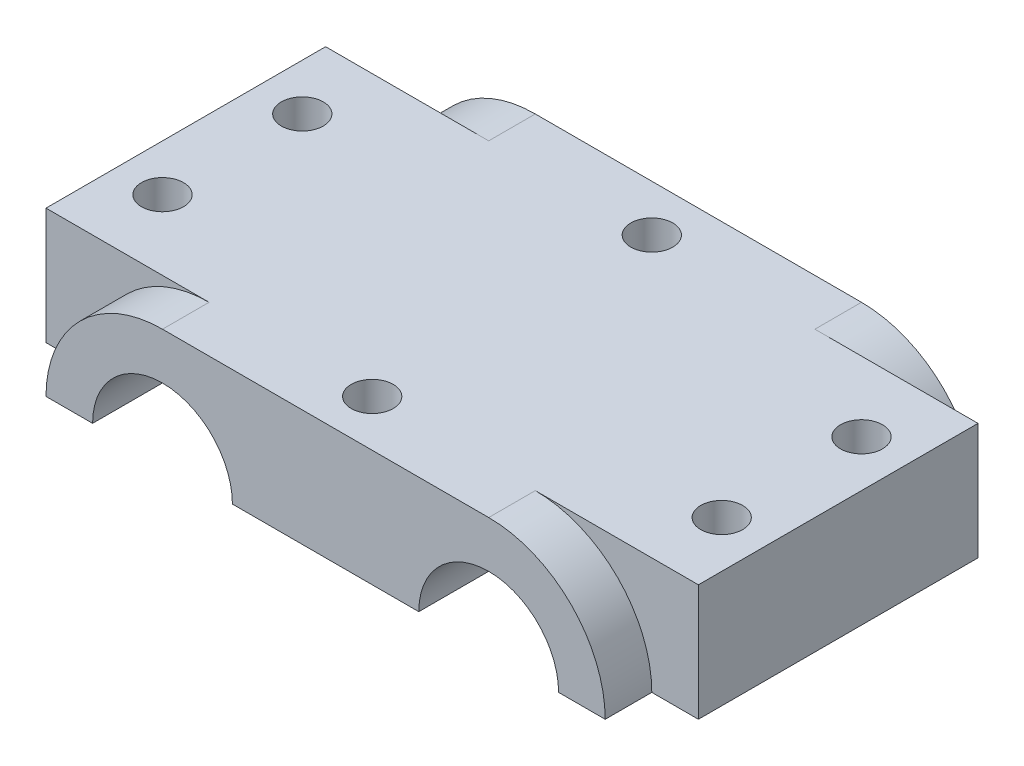
ISO-10303-21;
HEADER;
FILE_DESCRIPTION(('STEP AP214'),'2;1');
FILE_NAME('part.step','',(''),(''),'','','');
FILE_SCHEMA(('AUTOMOTIVE_DESIGN { 1 0 10303 214 1 1 1 1 }'));
ENDSEC;
DATA;
#1=APPLICATION_CONTEXT('core data for automotive mechanical design processes');
#2=APPLICATION_PROTOCOL_DEFINITION('international standard','automotive_design',2000,#1);
#3=PRODUCT_CONTEXT('',#1,'mechanical');
#4=PRODUCT('Part','Part','',(#3));
#5=PRODUCT_RELATED_PRODUCT_CATEGORY('part','',(#4));
#6=PRODUCT_DEFINITION_FORMATION('','',#4);
#7=PRODUCT_DEFINITION_CONTEXT('part definition',#1,'design');
#8=PRODUCT_DEFINITION('design','',#6,#7);
#9=PRODUCT_DEFINITION_SHAPE('','',#8);
#10=(LENGTH_UNIT() NAMED_UNIT(*) SI_UNIT(.MILLI.,.METRE.));
#11=(NAMED_UNIT(*) PLANE_ANGLE_UNIT() SI_UNIT($,.RADIAN.));
#12=(NAMED_UNIT(*) SI_UNIT($,.STERADIAN.) SOLID_ANGLE_UNIT());
#13=UNCERTAINTY_MEASURE_WITH_UNIT(LENGTH_MEASURE(1.E-05),#10,'distance_accuracy_value','');
#14=(GEOMETRIC_REPRESENTATION_CONTEXT(3) GLOBAL_UNCERTAINTY_ASSIGNED_CONTEXT((#13)) GLOBAL_UNIT_ASSIGNED_CONTEXT((#10,
#11,#12)) REPRESENTATION_CONTEXT('',''));
#15=CARTESIAN_POINT('',(0.,0.,0.));
#16=DIRECTION('',(0.,0.,1.));
#17=DIRECTION('',(1.,0.,0.));
#18=AXIS2_PLACEMENT_3D('',#15,#16,#17);
#19=CARTESIAN_POINT('',(-17.5,12.5,20.));
#20=DIRECTION('',(0.,-1.,0.));
#21=DIRECTION('',(0.,0.,-1.));
#22=AXIS2_PLACEMENT_3D('',#19,#20,#21);
#23=PLANE('',#22);
#24=CARTESIAN_POINT('',(0.,12.5,-15.));
#25=DIRECTION('',(0.,1.,0.));
#26=DIRECTION('',(0.,0.,1.));
#27=AXIS2_PLACEMENT_3D('',#24,#25,#26);
#28=CIRCLE('',#27,2.24999999999999);
#29=CARTESIAN_POINT('',(0.,12.5,-12.75));
#30=VERTEX_POINT('',#29);
#31=EDGE_CURVE('E318',#30,#30,#28,.T.);
#32=ORIENTED_EDGE('',*,*,#31,.F.);
#33=EDGE_LOOP('',(#32));
#34=FACE_BOUND('',#33,.T.);
#35=CARTESIAN_POINT('',(30.,12.5,-7.5));
#36=DIRECTION('',(0.,1.,0.));
#37=DIRECTION('',(0.,0.,1.));
#38=AXIS2_PLACEMENT_3D('',#35,#36,#37);
#39=CIRCLE('',#38,2.24999999999998);
#40=CARTESIAN_POINT('',(30.,12.5,-5.25000000000002));
#41=VERTEX_POINT('',#40);
#42=EDGE_CURVE('E306',#41,#41,#39,.T.);
#43=ORIENTED_EDGE('',*,*,#42,.F.);
#44=EDGE_LOOP('',(#43));
#45=FACE_BOUND('',#44,.T.);
#46=CARTESIAN_POINT('',(30.,12.5,7.5));
#47=DIRECTION('',(0.,1.,0.));
#48=DIRECTION('',(0.,0.,1.));
#49=AXIS2_PLACEMENT_3D('',#46,#47,#48);
#50=CIRCLE('',#49,2.24999999999998);
#51=CARTESIAN_POINT('',(30.,12.5,9.74999999999998));
#52=VERTEX_POINT('',#51);
#53=EDGE_CURVE('E300',#52,#52,#50,.T.);
#54=ORIENTED_EDGE('',*,*,#53,.F.);
#55=EDGE_LOOP('',(#54));
#56=FACE_BOUND('',#55,.T.);
#57=CARTESIAN_POINT('',(-30.,12.5,7.5));
#58=DIRECTION('',(0.,1.,0.));
#59=DIRECTION('',(0.,0.,1.));
#60=AXIS2_PLACEMENT_3D('',#57,#58,#59);
#61=CIRCLE('',#60,2.24999999999999);
#62=CARTESIAN_POINT('',(-30.,12.5,9.74999999999999));
#63=VERTEX_POINT('',#62);
#64=EDGE_CURVE('E294',#63,#63,#61,.T.);
#65=ORIENTED_EDGE('',*,*,#64,.F.);
#66=EDGE_LOOP('',(#65));
#67=FACE_BOUND('',#66,.T.);
#68=CARTESIAN_POINT('',(-30.,12.5,-7.5));
#69=DIRECTION('',(0.,1.,0.));
#70=DIRECTION('',(0.,0.,1.));
#71=AXIS2_PLACEMENT_3D('',#68,#69,#70);
#72=CIRCLE('',#71,2.24999999999999);
#73=CARTESIAN_POINT('',(-30.,12.5,-5.25000000000001));
#74=VERTEX_POINT('',#73);
#75=EDGE_CURVE('E288',#74,#74,#72,.T.);
#76=ORIENTED_EDGE('',*,*,#75,.F.);
#77=EDGE_LOOP('',(#76));
#78=FACE_BOUND('',#77,.T.);
#79=DIRECTION('',(-1.,0.,0.));
#80=VECTOR('',#79,1.);
#81=CARTESIAN_POINT('',(-17.5,12.5,-20.));
#82=LINE('',#81,#80);
#83=CARTESIAN_POINT('',(17.5,12.5,-20.));
#84=VERTEX_POINT('',#83);
#85=CARTESIAN_POINT('',(-17.5,12.5,-20.));
#86=VERTEX_POINT('',#85);
#87=EDGE_CURVE('E229',#84,#86,#82,.T.);
#88=ORIENTED_EDGE('',*,*,#87,.T.);
#89=DIRECTION('',(0.,0.,-1.));
#90=VECTOR('',#89,1.);
#91=CARTESIAN_POINT('',(-17.5,12.5,20.));
#92=LINE('',#91,#90);
#93=CARTESIAN_POINT('',(-17.5,12.5,-15.));
#94=VERTEX_POINT('',#93);
#95=EDGE_CURVE('E209',#94,#86,#92,.T.);
#96=ORIENTED_EDGE('',*,*,#95,.F.);
#97=DIRECTION('',(-1.,0.,0.));
#98=VECTOR('',#97,1.);
#99=CARTESIAN_POINT('',(0.,12.5,-15.));
#100=LINE('',#99,#98);
#101=CARTESIAN_POINT('',(-35.,12.5,-15.));
#102=VERTEX_POINT('',#101);
#103=EDGE_CURVE('E259',#94,#102,#100,.T.);
#104=ORIENTED_EDGE('',*,*,#103,.T.);
#105=DIRECTION('',(0.,0.,-1.));
#106=VECTOR('',#105,1.);
#107=CARTESIAN_POINT('',(-35.,12.5,15.));
#108=LINE('',#107,#106);
#109=CARTESIAN_POINT('',(-35.,12.5,15.));
#110=VERTEX_POINT('',#109);
#111=EDGE_CURVE('E211',#110,#102,#108,.T.);
#112=ORIENTED_EDGE('',*,*,#111,.F.);
#113=DIRECTION('',(-1.,0.,0.));
#114=VECTOR('',#113,1.);
#115=CARTESIAN_POINT('',(0.,12.5,15.));
#116=LINE('',#115,#114);
#117=CARTESIAN_POINT('',(-17.5,12.5,15.));
#118=VERTEX_POINT('',#117);
#119=EDGE_CURVE('E269',#118,#110,#116,.T.);
#120=ORIENTED_EDGE('',*,*,#119,.F.);
#121=CARTESIAN_POINT('',(-17.5,12.5,20.));
#122=VERTEX_POINT('',#121);
#123=EDGE_CURVE('E231',#122,#118,#92,.T.);
#124=ORIENTED_EDGE('',*,*,#123,.F.);
#125=DIRECTION('',(-1.,0.,0.));
#126=VECTOR('',#125,1.);
#127=CARTESIAN_POINT('',(-17.5,12.5,20.));
#128=LINE('',#127,#126);
#129=CARTESIAN_POINT('',(17.5,12.5,20.));
#130=VERTEX_POINT('',#129);
#131=EDGE_CURVE('E216',#130,#122,#128,.T.);
#132=ORIENTED_EDGE('',*,*,#131,.F.);
#133=DIRECTION('',(0.,0.,-1.));
#134=VECTOR('',#133,1.);
#135=CARTESIAN_POINT('',(17.5,12.5,20.));
#136=LINE('',#135,#134);
#137=CARTESIAN_POINT('',(17.5,12.5,15.));
#138=VERTEX_POINT('',#137);
#139=EDGE_CURVE('E179',#130,#138,#136,.T.);
#140=ORIENTED_EDGE('',*,*,#139,.T.);
#141=DIRECTION('',(1.,0.,0.));
#142=VECTOR('',#141,1.);
#143=CARTESIAN_POINT('',(0.,12.5,15.));
#144=LINE('',#143,#142);
#145=CARTESIAN_POINT('',(35.,12.5,15.));
#146=VERTEX_POINT('',#145);
#147=EDGE_CURVE('E153',#138,#146,#144,.T.);
#148=ORIENTED_EDGE('',*,*,#147,.T.);
#149=DIRECTION('',(0.,0.,-1.));
#150=VECTOR('',#149,1.);
#151=CARTESIAN_POINT('',(35.,12.5,15.));
#152=LINE('',#151,#150);
#153=CARTESIAN_POINT('',(35.,12.5,-15.));
#154=VERTEX_POINT('',#153);
#155=EDGE_CURVE('E273',#146,#154,#152,.T.);
#156=ORIENTED_EDGE('',*,*,#155,.T.);
#157=DIRECTION('',(1.,0.,0.));
#158=VECTOR('',#157,1.);
#159=CARTESIAN_POINT('',(0.,12.5,-15.));
#160=LINE('',#159,#158);
#161=CARTESIAN_POINT('',(17.5,12.5,-15.));
#162=VERTEX_POINT('',#161);
#163=EDGE_CURVE('E50',#162,#154,#160,.T.);
#164=ORIENTED_EDGE('',*,*,#163,.F.);
#165=EDGE_CURVE('E232',#162,#84,#136,.T.);
#166=ORIENTED_EDGE('',*,*,#165,.T.);
#167=EDGE_LOOP('',(#88,#96,#104,#112,#120,#124,#132,#140,#148,#156,#164,#166));
#168=FACE_BOUND('',#167,.T.);
#169=CARTESIAN_POINT('',(0.,12.5,15.));
#170=DIRECTION('',(0.,1.,0.));
#171=DIRECTION('',(0.,0.,1.));
#172=AXIS2_PLACEMENT_3D('',#169,#170,#171);
#173=CIRCLE('',#172,2.24999999999999);
#174=CARTESIAN_POINT('',(0.,12.5,17.25));
#175=VERTEX_POINT('',#174);
#176=EDGE_CURVE('E312',#175,#175,#173,.T.);
#177=ORIENTED_EDGE('',*,*,#176,.F.);
#178=EDGE_LOOP('',(#177));
#179=FACE_BOUND('',#178,.T.);
#180=ADVANCED_FACE('F35',(#34,#45,#56,#67,#78,#168,#179),#23,.F.);
#181=CARTESIAN_POINT('',(17.5,0.,20.));
#182=DIRECTION('',(0.,0.,-1.));
#183=DIRECTION('',(-1.,0.,0.));
#184=AXIS2_PLACEMENT_3D('',#181,#182,#183);
#185=CYLINDRICAL_SURFACE('',#184,12.5);
#186=CARTESIAN_POINT('',(17.5,0.,-15.));
#187=DIRECTION('',(0.,0.,1.));
#188=DIRECTION('',(1.,0.,0.));
#189=AXIS2_PLACEMENT_3D('',#186,#187,#188);
#190=CIRCLE('',#189,12.5);
#191=CARTESIAN_POINT('',(30.,0.,-15.));
#192=VERTEX_POINT('',#191);
#193=EDGE_CURVE('E281',#192,#162,#190,.T.);
#194=ORIENTED_EDGE('',*,*,#193,.F.);
#195=DIRECTION('',(0.,0.,-1.));
#196=VECTOR('',#195,1.);
#197=CARTESIAN_POINT('',(30.,0.,20.));
#198=LINE('',#197,#196);
#199=CARTESIAN_POINT('',(30.,0.,-20.));
#200=VERTEX_POINT('',#199);
#201=EDGE_CURVE('E174',#192,#200,#198,.T.);
#202=ORIENTED_EDGE('',*,*,#201,.T.);
#203=CARTESIAN_POINT('',(17.5,0.,-20.));
#204=DIRECTION('',(0.,0.,1.));
#205=DIRECTION('',(-1.,0.,0.));
#206=AXIS2_PLACEMENT_3D('',#203,#204,#205);
#207=CIRCLE('',#206,12.5);
#208=EDGE_CURVE('E226',#200,#84,#207,.T.);
#209=ORIENTED_EDGE('',*,*,#208,.T.);
#210=ORIENTED_EDGE('',*,*,#165,.F.);
#211=EDGE_LOOP('',(#194,#202,#209,#210));
#212=FACE_BOUND('',#211,.T.);
#213=ADVANCED_FACE('F326',(#212),#185,.T.);
#214=CARTESIAN_POINT('',(-17.5,0.,20.));
#215=DIRECTION('',(0.,0.,-1.));
#216=DIRECTION('',(-1.,0.,0.));
#217=AXIS2_PLACEMENT_3D('',#214,#215,#216);
#218=CYLINDRICAL_SURFACE('',#217,12.5);
#219=CARTESIAN_POINT('',(-17.5,0.,-15.));
#220=DIRECTION('',(0.,0.,1.));
#221=DIRECTION('',(1.,0.,0.));
#222=AXIS2_PLACEMENT_3D('',#219,#220,#221);
#223=CIRCLE('',#222,12.5);
#224=CARTESIAN_POINT('',(-30.,0.,-15.));
#225=VERTEX_POINT('',#224);
#226=EDGE_CURVE('E262',#94,#225,#223,.T.);
#227=ORIENTED_EDGE('',*,*,#226,.F.);
#228=ORIENTED_EDGE('',*,*,#95,.T.);
#229=CARTESIAN_POINT('',(-17.5,0.,-20.));
#230=DIRECTION('',(0.,0.,1.));
#231=DIRECTION('',(1.,0.,0.));
#232=AXIS2_PLACEMENT_3D('',#229,#230,#231);
#233=CIRCLE('',#232,12.5);
#234=CARTESIAN_POINT('',(-30.,0.,-20.));
#235=VERTEX_POINT('',#234);
#236=EDGE_CURVE('E204',#86,#235,#233,.T.);
#237=ORIENTED_EDGE('',*,*,#236,.T.);
#238=DIRECTION('',(0.,0.,-1.));
#239=VECTOR('',#238,1.);
#240=CARTESIAN_POINT('',(-30.,0.,20.));
#241=LINE('',#240,#239);
#242=EDGE_CURVE('E43',#225,#235,#241,.T.);
#243=ORIENTED_EDGE('',*,*,#242,.F.);
#244=EDGE_LOOP('',(#227,#228,#237,#243));
#245=FACE_BOUND('',#244,.T.);
#246=ADVANCED_FACE('F208',(#245),#218,.T.);
#247=ORIENTED_EDGE('',*,*,#123,.T.);
#248=CARTESIAN_POINT('',(-17.5,0.,15.));
#249=DIRECTION('',(0.,0.,1.));
#250=DIRECTION('',(1.,0.,0.));
#251=AXIS2_PLACEMENT_3D('',#248,#249,#250);
#252=CIRCLE('',#251,12.5);
#253=CARTESIAN_POINT('',(-30.,0.,15.));
#254=VERTEX_POINT('',#253);
#255=EDGE_CURVE('E255',#118,#254,#252,.T.);
#256=ORIENTED_EDGE('',*,*,#255,.T.);
#257=CARTESIAN_POINT('',(-30.,0.,20.));
#258=VERTEX_POINT('',#257);
#259=EDGE_CURVE('E11',#258,#254,#241,.T.);
#260=ORIENTED_EDGE('',*,*,#259,.F.);
#261=CARTESIAN_POINT('',(-17.5,0.,20.));
#262=DIRECTION('',(0.,0.,1.));
#263=DIRECTION('',(1.,0.,0.));
#264=AXIS2_PLACEMENT_3D('',#261,#262,#263);
#265=CIRCLE('',#264,12.5);
#266=EDGE_CURVE('E230',#122,#258,#265,.T.);
#267=ORIENTED_EDGE('',*,*,#266,.F.);
#268=EDGE_LOOP('',(#247,#256,#260,#267));
#269=FACE_BOUND('',#268,.T.);
#270=ADVANCED_FACE('F37',(#269),#218,.T.);
#271=CARTESIAN_POINT('',(-30.,0.,20.));
#272=DIRECTION('',(0.,1.,0.));
#273=DIRECTION('',(-1.,0.,0.));
#274=AXIS2_PLACEMENT_3D('',#271,#272,#273);
#275=PLANE('',#274);
#276=CARTESIAN_POINT('',(-30.,0.,7.5));
#277=DIRECTION('',(0.,1.,0.));
#278=DIRECTION('',(0.,0.,1.));
#279=AXIS2_PLACEMENT_3D('',#276,#277,#278);
#280=CIRCLE('',#279,2.25);
#281=CARTESIAN_POINT('',(-30.,0.,9.75));
#282=VERTEX_POINT('',#281);
#283=EDGE_CURVE('E291',#282,#282,#280,.T.);
#284=ORIENTED_EDGE('',*,*,#283,.T.);
#285=EDGE_LOOP('',(#284));
#286=FACE_BOUND('',#285,.T.);
#287=CARTESIAN_POINT('',(-30.,0.,-7.5));
#288=DIRECTION('',(0.,1.,0.));
#289=DIRECTION('',(0.,0.,1.));
#290=AXIS2_PLACEMENT_3D('',#287,#288,#289);
#291=CIRCLE('',#290,2.25);
#292=CARTESIAN_POINT('',(-30.,0.,-5.25));
#293=VERTEX_POINT('',#292);
#294=EDGE_CURVE('E283',#293,#293,#291,.T.);
#295=ORIENTED_EDGE('',*,*,#294,.T.);
#296=EDGE_LOOP('',(#295));
#297=FACE_BOUND('',#296,.T.);
#298=DIRECTION('',(1.,0.,0.));
#299=VECTOR('',#298,1.);
#300=CARTESIAN_POINT('',(-30.,0.,-20.));
#301=LINE('',#300,#299);
#302=CARTESIAN_POINT('',(-25.,0.,-20.));
#303=VERTEX_POINT('',#302);
#304=EDGE_CURVE('E196',#235,#303,#301,.T.);
#305=ORIENTED_EDGE('',*,*,#304,.T.);
#306=DIRECTION('',(0.,0.,-1.));
#307=VECTOR('',#306,1.);
#308=CARTESIAN_POINT('',(-25.,0.,20.));
#309=LINE('',#308,#307);
#310=CARTESIAN_POINT('',(-25.,0.,20.));
#311=VERTEX_POINT('',#310);
#312=EDGE_CURVE('E187',#311,#303,#309,.T.);
#313=ORIENTED_EDGE('',*,*,#312,.F.);
#314=DIRECTION('',(1.,0.,0.));
#315=VECTOR('',#314,1.);
#316=CARTESIAN_POINT('',(-30.,0.,20.));
#317=LINE('',#316,#315);
#318=EDGE_CURVE('E249',#258,#311,#317,.T.);
#319=ORIENTED_EDGE('',*,*,#318,.F.);
#320=ORIENTED_EDGE('',*,*,#259,.T.);
#321=DIRECTION('',(1.,0.,0.));
#322=VECTOR('',#321,1.);
#323=CARTESIAN_POINT('',(0.,0.,15.));
#324=LINE('',#323,#322);
#325=CARTESIAN_POINT('',(-35.,0.,15.));
#326=VERTEX_POINT('',#325);
#327=EDGE_CURVE('E253',#326,#254,#324,.T.);
#328=ORIENTED_EDGE('',*,*,#327,.F.);
#329=DIRECTION('',(0.,0.,-1.));
#330=VECTOR('',#329,1.);
#331=CARTESIAN_POINT('',(-35.,0.,15.));
#332=LINE('',#331,#330);
#333=CARTESIAN_POINT('',(-35.,0.,-15.));
#334=VERTEX_POINT('',#333);
#335=EDGE_CURVE('E213',#326,#334,#332,.T.);
#336=ORIENTED_EDGE('',*,*,#335,.T.);
#337=DIRECTION('',(1.,0.,0.));
#338=VECTOR('',#337,1.);
#339=CARTESIAN_POINT('',(0.,0.,-15.));
#340=LINE('',#339,#338);
#341=EDGE_CURVE('E198',#334,#225,#340,.T.);
#342=ORIENTED_EDGE('',*,*,#341,.T.);
#343=ORIENTED_EDGE('',*,*,#242,.T.);
#344=EDGE_LOOP('',(#305,#313,#319,#320,#328,#336,#342,#343));
#345=FACE_BOUND('',#344,.T.);
#346=ADVANCED_FACE('F195',(#286,#297,#345),#275,.F.);
#347=CARTESIAN_POINT('',(-17.5,0.,20.));
#348=DIRECTION('',(0.,0.,-1.));
#349=DIRECTION('',(-1.,0.,0.));
#350=AXIS2_PLACEMENT_3D('',#347,#348,#349);
#351=CYLINDRICAL_SURFACE('',#350,7.5);
#352=CARTESIAN_POINT('',(-17.5,0.,-20.));
#353=DIRECTION('',(0.,0.,-1.));
#354=DIRECTION('',(1.,0.,0.));
#355=AXIS2_PLACEMENT_3D('',#352,#353,#354);
#356=CIRCLE('',#355,7.5);
#357=CARTESIAN_POINT('',(-10.,0.,-20.));
#358=VERTEX_POINT('',#357);
#359=EDGE_CURVE('E206',#303,#358,#356,.T.);
#360=ORIENTED_EDGE('',*,*,#359,.T.);
#361=DIRECTION('',(0.,0.,-1.));
#362=VECTOR('',#361,1.);
#363=CARTESIAN_POINT('',(-10.,0.,20.));
#364=LINE('',#363,#362);
#365=CARTESIAN_POINT('',(-10.,0.,20.));
#366=VERTEX_POINT('',#365);
#367=EDGE_CURVE('E185',#366,#358,#364,.T.);
#368=ORIENTED_EDGE('',*,*,#367,.F.);
#369=CARTESIAN_POINT('',(-17.5,0.,20.));
#370=DIRECTION('',(0.,0.,-1.));
#371=DIRECTION('',(1.,0.,0.));
#372=AXIS2_PLACEMENT_3D('',#369,#370,#371);
#373=CIRCLE('',#372,7.5);
#374=EDGE_CURVE('E247',#311,#366,#373,.T.);
#375=ORIENTED_EDGE('',*,*,#374,.F.);
#376=ORIENTED_EDGE('',*,*,#312,.T.);
#377=EDGE_LOOP('',(#360,#368,#375,#376));
#378=FACE_BOUND('',#377,.T.);
#379=ADVANCED_FACE('F404',(#378),#351,.F.);
#380=CARTESIAN_POINT('',(-10.,0.,20.));
#381=DIRECTION('',(0.,1.,0.));
#382=DIRECTION('',(0.,0.,1.));
#383=AXIS2_PLACEMENT_3D('',#380,#381,#382);
#384=PLANE('',#383);
#385=CARTESIAN_POINT('',(0.,0.,-15.));
#386=DIRECTION('',(0.,1.,0.));
#387=DIRECTION('',(0.,0.,1.));
#388=AXIS2_PLACEMENT_3D('',#385,#386,#387);
#389=CIRCLE('',#388,2.25);
#390=CARTESIAN_POINT('',(0.,0.,-12.75));
#391=VERTEX_POINT('',#390);
#392=EDGE_CURVE('E315',#391,#391,#389,.T.);
#393=ORIENTED_EDGE('',*,*,#392,.T.);
#394=EDGE_LOOP('',(#393));
#395=FACE_BOUND('',#394,.T.);
#396=CARTESIAN_POINT('',(0.,0.,15.));
#397=DIRECTION('',(0.,1.,0.));
#398=DIRECTION('',(0.,0.,1.));
#399=AXIS2_PLACEMENT_3D('',#396,#397,#398);
#400=CIRCLE('',#399,2.25);
#401=CARTESIAN_POINT('',(0.,0.,17.25));
#402=VERTEX_POINT('',#401);
#403=EDGE_CURVE('E309',#402,#402,#400,.T.);
#404=ORIENTED_EDGE('',*,*,#403,.T.);
#405=EDGE_LOOP('',(#404));
#406=FACE_BOUND('',#405,.T.);
#407=DIRECTION('',(1.,0.,0.));
#408=VECTOR('',#407,1.);
#409=CARTESIAN_POINT('',(-10.,0.,-20.));
#410=LINE('',#409,#408);
#411=CARTESIAN_POINT('',(10.,0.,-20.));
#412=VERTEX_POINT('',#411);
#413=EDGE_CURVE('E220',#358,#412,#410,.T.);
#414=ORIENTED_EDGE('',*,*,#413,.T.);
#415=DIRECTION('',(0.,0.,-1.));
#416=VECTOR('',#415,1.);
#417=CARTESIAN_POINT('',(10.,0.,20.));
#418=LINE('',#417,#416);
#419=CARTESIAN_POINT('',(10.,0.,20.));
#420=VERTEX_POINT('',#419);
#421=EDGE_CURVE('E177',#420,#412,#418,.T.);
#422=ORIENTED_EDGE('',*,*,#421,.F.);
#423=DIRECTION('',(1.,0.,0.));
#424=VECTOR('',#423,1.);
#425=CARTESIAN_POINT('',(-10.,0.,20.));
#426=LINE('',#425,#424);
#427=EDGE_CURVE('E245',#366,#420,#426,.T.);
#428=ORIENTED_EDGE('',*,*,#427,.F.);
#429=ORIENTED_EDGE('',*,*,#367,.T.);
#430=EDGE_LOOP('',(#414,#422,#428,#429));
#431=FACE_BOUND('',#430,.T.);
#432=ADVANCED_FACE('F400',(#395,#406,#431),#384,.F.);
#433=CARTESIAN_POINT('',(17.5,0.,20.));
#434=DIRECTION('',(0.,0.,-1.));
#435=DIRECTION('',(-1.,0.,0.));
#436=AXIS2_PLACEMENT_3D('',#433,#434,#435);
#437=CYLINDRICAL_SURFACE('',#436,7.5);
#438=CARTESIAN_POINT('',(17.5,0.,-20.));
#439=DIRECTION('',(0.,0.,-1.));
#440=DIRECTION('',(-1.,0.,0.));
#441=AXIS2_PLACEMENT_3D('',#438,#439,#440);
#442=CIRCLE('',#441,7.5);
#443=CARTESIAN_POINT('',(25.,0.,-20.));
#444=VERTEX_POINT('',#443);
#445=EDGE_CURVE('E222',#412,#444,#442,.T.);
#446=ORIENTED_EDGE('',*,*,#445,.T.);
#447=DIRECTION('',(0.,0.,-1.));
#448=VECTOR('',#447,1.);
#449=CARTESIAN_POINT('',(25.,0.,20.));
#450=LINE('',#449,#448);
#451=CARTESIAN_POINT('',(25.,0.,20.));
#452=VERTEX_POINT('',#451);
#453=EDGE_CURVE('E173',#452,#444,#450,.T.);
#454=ORIENTED_EDGE('',*,*,#453,.F.);
#455=CARTESIAN_POINT('',(17.5,0.,20.));
#456=DIRECTION('',(0.,0.,-1.));
#457=DIRECTION('',(-1.,0.,0.));
#458=AXIS2_PLACEMENT_3D('',#455,#456,#457);
#459=CIRCLE('',#458,7.5);
#460=EDGE_CURVE('E241',#420,#452,#459,.T.);
#461=ORIENTED_EDGE('',*,*,#460,.F.);
#462=ORIENTED_EDGE('',*,*,#421,.T.);
#463=EDGE_LOOP('',(#446,#454,#461,#462));
#464=FACE_BOUND('',#463,.T.);
#465=ADVANCED_FACE('F396',(#464),#437,.F.);
#466=CARTESIAN_POINT('',(30.,0.,20.));
#467=DIRECTION('',(0.,1.,0.));
#468=DIRECTION('',(-1.,0.,0.));
#469=AXIS2_PLACEMENT_3D('',#466,#467,#468);
#470=PLANE('',#469);
#471=CARTESIAN_POINT('',(30.,0.,-7.5));
#472=DIRECTION('',(0.,1.,0.));
#473=DIRECTION('',(0.,0.,1.));
#474=AXIS2_PLACEMENT_3D('',#471,#472,#473);
#475=CIRCLE('',#474,2.25);
#476=CARTESIAN_POINT('',(30.,0.,-5.25));
#477=VERTEX_POINT('',#476);
#478=EDGE_CURVE('E303',#477,#477,#475,.T.);
#479=ORIENTED_EDGE('',*,*,#478,.T.);
#480=EDGE_LOOP('',(#479));
#481=FACE_BOUND('',#480,.T.);
#482=CARTESIAN_POINT('',(30.,0.,7.5));
#483=DIRECTION('',(0.,1.,0.));
#484=DIRECTION('',(0.,0.,1.));
#485=AXIS2_PLACEMENT_3D('',#482,#483,#484);
#486=CIRCLE('',#485,2.25);
#487=CARTESIAN_POINT('',(30.,0.,9.75));
#488=VERTEX_POINT('',#487);
#489=EDGE_CURVE('E297',#488,#488,#486,.T.);
#490=ORIENTED_EDGE('',*,*,#489,.T.);
#491=EDGE_LOOP('',(#490));
#492=FACE_BOUND('',#491,.T.);
#493=DIRECTION('',(1.,0.,0.));
#494=VECTOR('',#493,1.);
#495=CARTESIAN_POINT('',(30.,0.,-20.));
#496=LINE('',#495,#494);
#497=EDGE_CURVE('E224',#444,#200,#496,.T.);
#498=ORIENTED_EDGE('',*,*,#497,.T.);
#499=ORIENTED_EDGE('',*,*,#201,.F.);
#500=DIRECTION('',(-1.,0.,0.));
#501=VECTOR('',#500,1.);
#502=CARTESIAN_POINT('',(0.,0.,-15.));
#503=LINE('',#502,#501);
#504=CARTESIAN_POINT('',(35.,0.,-15.));
#505=VERTEX_POINT('',#504);
#506=EDGE_CURVE('E279',#505,#192,#503,.T.);
#507=ORIENTED_EDGE('',*,*,#506,.F.);
#508=DIRECTION('',(0.,0.,-1.));
#509=VECTOR('',#508,1.);
#510=CARTESIAN_POINT('',(35.,0.,15.));
#511=LINE('',#510,#509);
#512=CARTESIAN_POINT('',(35.,0.,15.));
#513=VERTEX_POINT('',#512);
#514=EDGE_CURVE('E167',#513,#505,#511,.T.);
#515=ORIENTED_EDGE('',*,*,#514,.F.);
#516=DIRECTION('',(-1.,0.,0.));
#517=VECTOR('',#516,1.);
#518=CARTESIAN_POINT('',(0.,0.,15.));
#519=LINE('',#518,#517);
#520=CARTESIAN_POINT('',(30.,0.,15.));
#521=VERTEX_POINT('',#520);
#522=EDGE_CURVE('E151',#513,#521,#519,.T.);
#523=ORIENTED_EDGE('',*,*,#522,.T.);
#524=CARTESIAN_POINT('',(30.,0.,20.));
#525=VERTEX_POINT('',#524);
#526=EDGE_CURVE('E164',#525,#521,#198,.T.);
#527=ORIENTED_EDGE('',*,*,#526,.F.);
#528=DIRECTION('',(1.,0.,0.));
#529=VECTOR('',#528,1.);
#530=CARTESIAN_POINT('',(30.,0.,20.));
#531=LINE('',#530,#529);
#532=EDGE_CURVE('E240',#452,#525,#531,.T.);
#533=ORIENTED_EDGE('',*,*,#532,.F.);
#534=ORIENTED_EDGE('',*,*,#453,.T.);
#535=EDGE_LOOP('',(#498,#499,#507,#515,#523,#527,#533,#534));
#536=FACE_BOUND('',#535,.T.);
#537=ADVANCED_FACE('F162',(#481,#492,#536),#470,.F.);
#538=ORIENTED_EDGE('',*,*,#526,.T.);
#539=CARTESIAN_POINT('',(17.5,0.,15.));
#540=DIRECTION('',(0.,0.,1.));
#541=DIRECTION('',(1.,0.,0.));
#542=AXIS2_PLACEMENT_3D('',#539,#540,#541);
#543=CIRCLE('',#542,12.5);
#544=EDGE_CURVE('E148',#521,#138,#543,.T.);
#545=ORIENTED_EDGE('',*,*,#544,.T.);
#546=ORIENTED_EDGE('',*,*,#139,.F.);
#547=CARTESIAN_POINT('',(17.5,0.,20.));
#548=DIRECTION('',(0.,0.,1.));
#549=DIRECTION('',(-1.,0.,0.));
#550=AXIS2_PLACEMENT_3D('',#547,#548,#549);
#551=CIRCLE('',#550,12.5);
#552=EDGE_CURVE('E172',#525,#130,#551,.T.);
#553=ORIENTED_EDGE('',*,*,#552,.F.);
#554=EDGE_LOOP('',(#538,#545,#546,#553));
#555=FACE_BOUND('',#554,.T.);
#556=ADVANCED_FACE('F171',(#555),#185,.T.);
#557=CARTESIAN_POINT('',(-17.5,0.,20.));
#558=DIRECTION('',(0.,0.,1.));
#559=DIRECTION('',(1.,0.,0.));
#560=AXIS2_PLACEMENT_3D('',#557,#558,#559);
#561=PLANE('',#560);
#562=ORIENTED_EDGE('',*,*,#266,.T.);
#563=ORIENTED_EDGE('',*,*,#318,.T.);
#564=ORIENTED_EDGE('',*,*,#374,.T.);
#565=ORIENTED_EDGE('',*,*,#427,.T.);
#566=ORIENTED_EDGE('',*,*,#460,.T.);
#567=ORIENTED_EDGE('',*,*,#532,.T.);
#568=ORIENTED_EDGE('',*,*,#552,.T.);
#569=ORIENTED_EDGE('',*,*,#131,.T.);
#570=EDGE_LOOP('',(#562,#563,#564,#565,#566,#567,#568,#569));
#571=FACE_BOUND('',#570,.T.);
#572=ADVANCED_FACE('F387',(#571),#561,.T.);
#573=CARTESIAN_POINT('',(-17.5,0.,-20.));
#574=DIRECTION('',(0.,0.,1.));
#575=DIRECTION('',(1.,0.,0.));
#576=AXIS2_PLACEMENT_3D('',#573,#574,#575);
#577=PLANE('',#576);
#578=ORIENTED_EDGE('',*,*,#236,.F.);
#579=ORIENTED_EDGE('',*,*,#87,.F.);
#580=ORIENTED_EDGE('',*,*,#208,.F.);
#581=ORIENTED_EDGE('',*,*,#497,.F.);
#582=ORIENTED_EDGE('',*,*,#445,.F.);
#583=ORIENTED_EDGE('',*,*,#413,.F.);
#584=ORIENTED_EDGE('',*,*,#359,.F.);
#585=ORIENTED_EDGE('',*,*,#304,.F.);
#586=EDGE_LOOP('',(#578,#579,#580,#581,#582,#583,#584,#585));
#587=FACE_BOUND('',#586,.T.);
#588=ADVANCED_FACE('F202',(#587),#577,.F.);
#589=CARTESIAN_POINT('',(-35.,0.,15.));
#590=DIRECTION('',(-1.,0.,0.));
#591=DIRECTION('',(0.,0.,1.));
#592=AXIS2_PLACEMENT_3D('',#589,#590,#591);
#593=PLANE('',#592);
#594=DIRECTION('',(0.,1.,0.));
#595=VECTOR('',#594,1.);
#596=CARTESIAN_POINT('',(-35.,0.,-15.));
#597=LINE('',#596,#595);
#598=EDGE_CURVE('E256',#334,#102,#597,.T.);
#599=ORIENTED_EDGE('',*,*,#598,.F.);
#600=ORIENTED_EDGE('',*,*,#335,.F.);
#601=DIRECTION('',(0.,1.,0.));
#602=VECTOR('',#601,1.);
#603=CARTESIAN_POINT('',(-35.,0.,15.));
#604=LINE('',#603,#602);
#605=EDGE_CURVE('E266',#326,#110,#604,.T.);
#606=ORIENTED_EDGE('',*,*,#605,.T.);
#607=ORIENTED_EDGE('',*,*,#111,.T.);
#608=EDGE_LOOP('',(#599,#600,#606,#607));
#609=FACE_BOUND('',#608,.T.);
#610=ADVANCED_FACE('F379',(#609),#593,.T.);
#611=CARTESIAN_POINT('',(0.,0.,15.));
#612=DIRECTION('',(0.,0.,1.));
#613=DIRECTION('',(1.,0.,0.));
#614=AXIS2_PLACEMENT_3D('',#611,#612,#613);
#615=PLANE('',#614);
#616=ORIENTED_EDGE('',*,*,#255,.F.);
#617=ORIENTED_EDGE('',*,*,#119,.T.);
#618=ORIENTED_EDGE('',*,*,#605,.F.);
#619=ORIENTED_EDGE('',*,*,#327,.T.);
#620=EDGE_LOOP('',(#616,#617,#618,#619));
#621=FACE_BOUND('',#620,.T.);
#622=ADVANCED_FACE('F376',(#621),#615,.T.);
#623=CARTESIAN_POINT('',(0.,0.,-15.));
#624=DIRECTION('',(0.,0.,1.));
#625=DIRECTION('',(1.,0.,0.));
#626=AXIS2_PLACEMENT_3D('',#623,#624,#625);
#627=PLANE('',#626);
#628=ORIENTED_EDGE('',*,*,#226,.T.);
#629=ORIENTED_EDGE('',*,*,#341,.F.);
#630=ORIENTED_EDGE('',*,*,#598,.T.);
#631=ORIENTED_EDGE('',*,*,#103,.F.);
#632=EDGE_LOOP('',(#628,#629,#630,#631));
#633=FACE_BOUND('',#632,.T.);
#634=ADVANCED_FACE('F374',(#633),#627,.F.);
#635=CARTESIAN_POINT('',(35.,0.,15.));
#636=DIRECTION('',(-1.,0.,0.));
#637=DIRECTION('',(0.,0.,1.));
#638=AXIS2_PLACEMENT_3D('',#635,#636,#637);
#639=PLANE('',#638);
#640=DIRECTION('',(0.,1.,0.));
#641=VECTOR('',#640,1.);
#642=CARTESIAN_POINT('',(35.,0.,-15.));
#643=LINE('',#642,#641);
#644=EDGE_CURVE('E276',#505,#154,#643,.T.);
#645=ORIENTED_EDGE('',*,*,#644,.T.);
#646=ORIENTED_EDGE('',*,*,#155,.F.);
#647=DIRECTION('',(0.,1.,0.));
#648=VECTOR('',#647,1.);
#649=CARTESIAN_POINT('',(35.,0.,15.));
#650=LINE('',#649,#648);
#651=EDGE_CURVE('E169',#513,#146,#650,.T.);
#652=ORIENTED_EDGE('',*,*,#651,.F.);
#653=ORIENTED_EDGE('',*,*,#514,.T.);
#654=EDGE_LOOP('',(#645,#646,#652,#653));
#655=FACE_BOUND('',#654,.T.);
#656=ADVANCED_FACE('F368',(#655),#639,.F.);
#657=CARTESIAN_POINT('',(0.,0.,15.));
#658=DIRECTION('',(0.,0.,1.));
#659=DIRECTION('',(1.,0.,0.));
#660=AXIS2_PLACEMENT_3D('',#657,#658,#659);
#661=PLANE('',#660);
#662=ORIENTED_EDGE('',*,*,#544,.F.);
#663=ORIENTED_EDGE('',*,*,#522,.F.);
#664=ORIENTED_EDGE('',*,*,#651,.T.);
#665=ORIENTED_EDGE('',*,*,#147,.F.);
#666=EDGE_LOOP('',(#662,#663,#664,#665));
#667=FACE_BOUND('',#666,.T.);
#668=ADVANCED_FACE('F150',(#667),#661,.T.);
#669=CARTESIAN_POINT('',(0.,0.,-15.));
#670=DIRECTION('',(0.,0.,1.));
#671=DIRECTION('',(1.,0.,0.));
#672=AXIS2_PLACEMENT_3D('',#669,#670,#671);
#673=PLANE('',#672);
#674=ORIENTED_EDGE('',*,*,#193,.T.);
#675=ORIENTED_EDGE('',*,*,#163,.T.);
#676=ORIENTED_EDGE('',*,*,#644,.F.);
#677=ORIENTED_EDGE('',*,*,#506,.T.);
#678=EDGE_LOOP('',(#674,#675,#676,#677));
#679=FACE_BOUND('',#678,.T.);
#680=ADVANCED_FACE('F364',(#679),#673,.F.);
#681=CARTESIAN_POINT('',(-30.,12.5,-7.5));
#682=DIRECTION('',(0.,1.,0.));
#683=DIRECTION('',(0.,0.,1.));
#684=AXIS2_PLACEMENT_3D('',#681,#682,#683);
#685=CYLINDRICAL_SURFACE('',#684,2.24999999999999);
#686=ORIENTED_EDGE('',*,*,#294,.F.);
#687=EDGE_LOOP('',(#686));
#688=FACE_BOUND('',#687,.T.);
#689=ORIENTED_EDGE('',*,*,#75,.T.);
#690=EDGE_LOOP('',(#689));
#691=FACE_BOUND('',#690,.T.);
#692=ADVANCED_FACE('F360',(#688,#691),#685,.F.);
#693=CARTESIAN_POINT('',(-30.,12.5,7.5));
#694=DIRECTION('',(0.,1.,0.));
#695=DIRECTION('',(0.,0.,1.));
#696=AXIS2_PLACEMENT_3D('',#693,#694,#695);
#697=CYLINDRICAL_SURFACE('',#696,2.24999999999999);
#698=ORIENTED_EDGE('',*,*,#283,.F.);
#699=EDGE_LOOP('',(#698));
#700=FACE_BOUND('',#699,.T.);
#701=ORIENTED_EDGE('',*,*,#64,.T.);
#702=EDGE_LOOP('',(#701));
#703=FACE_BOUND('',#702,.T.);
#704=ADVANCED_FACE('F356',(#700,#703),#697,.F.);
#705=CARTESIAN_POINT('',(30.,12.5,7.5));
#706=DIRECTION('',(0.,1.,0.));
#707=DIRECTION('',(0.,0.,1.));
#708=AXIS2_PLACEMENT_3D('',#705,#706,#707);
#709=CYLINDRICAL_SURFACE('',#708,2.24999999999999);
#710=ORIENTED_EDGE('',*,*,#489,.F.);
#711=EDGE_LOOP('',(#710));
#712=FACE_BOUND('',#711,.T.);
#713=ORIENTED_EDGE('',*,*,#53,.T.);
#714=EDGE_LOOP('',(#713));
#715=FACE_BOUND('',#714,.T.);
#716=ADVANCED_FACE('F349',(#712,#715),#709,.F.);
#717=CARTESIAN_POINT('',(30.,12.5,-7.5));
#718=DIRECTION('',(0.,1.,0.));
#719=DIRECTION('',(0.,0.,1.));
#720=AXIS2_PLACEMENT_3D('',#717,#718,#719);
#721=CYLINDRICAL_SURFACE('',#720,2.24999999999999);
#722=ORIENTED_EDGE('',*,*,#478,.F.);
#723=EDGE_LOOP('',(#722));
#724=FACE_BOUND('',#723,.T.);
#725=ORIENTED_EDGE('',*,*,#42,.T.);
#726=EDGE_LOOP('',(#725));
#727=FACE_BOUND('',#726,.T.);
#728=ADVANCED_FACE('F340',(#724,#727),#721,.F.);
#729=CARTESIAN_POINT('',(0.,12.5,15.));
#730=DIRECTION('',(0.,1.,0.));
#731=DIRECTION('',(0.,0.,1.));
#732=AXIS2_PLACEMENT_3D('',#729,#730,#731);
#733=CYLINDRICAL_SURFACE('',#732,2.24999999999999);
#734=ORIENTED_EDGE('',*,*,#403,.F.);
#735=EDGE_LOOP('',(#734));
#736=FACE_BOUND('',#735,.T.);
#737=ORIENTED_EDGE('',*,*,#176,.T.);
#738=EDGE_LOOP('',(#737));
#739=FACE_BOUND('',#738,.T.);
#740=ADVANCED_FACE('F338',(#736,#739),#733,.F.);
#741=CARTESIAN_POINT('',(0.,12.5,-15.));
#742=DIRECTION('',(0.,1.,0.));
#743=DIRECTION('',(0.,0.,1.));
#744=AXIS2_PLACEMENT_3D('',#741,#742,#743);
#745=CYLINDRICAL_SURFACE('',#744,2.24999999999999);
#746=ORIENTED_EDGE('',*,*,#392,.F.);
#747=EDGE_LOOP('',(#746));
#748=FACE_BOUND('',#747,.T.);
#749=ORIENTED_EDGE('',*,*,#31,.T.);
#750=EDGE_LOOP('',(#749));
#751=FACE_BOUND('',#750,.T.);
#752=ADVANCED_FACE('F322',(#748,#751),#745,.F.);
#753=CLOSED_SHELL('',(#180,#213,#246,#270,#346,#379,#432,#465,#537,#556,#572,#588,#610,#622,
#634,#656,#668,#680,#692,#704,#716,#728,#740,#752));
#754=MANIFOLD_SOLID_BREP('B2',#753);
#755=ADVANCED_BREP_SHAPE_REPRESENTATION('',(#18,#754),#14);
#756=SHAPE_DEFINITION_REPRESENTATION(#9,#755);
ENDSEC;
END-ISO-10303-21;
